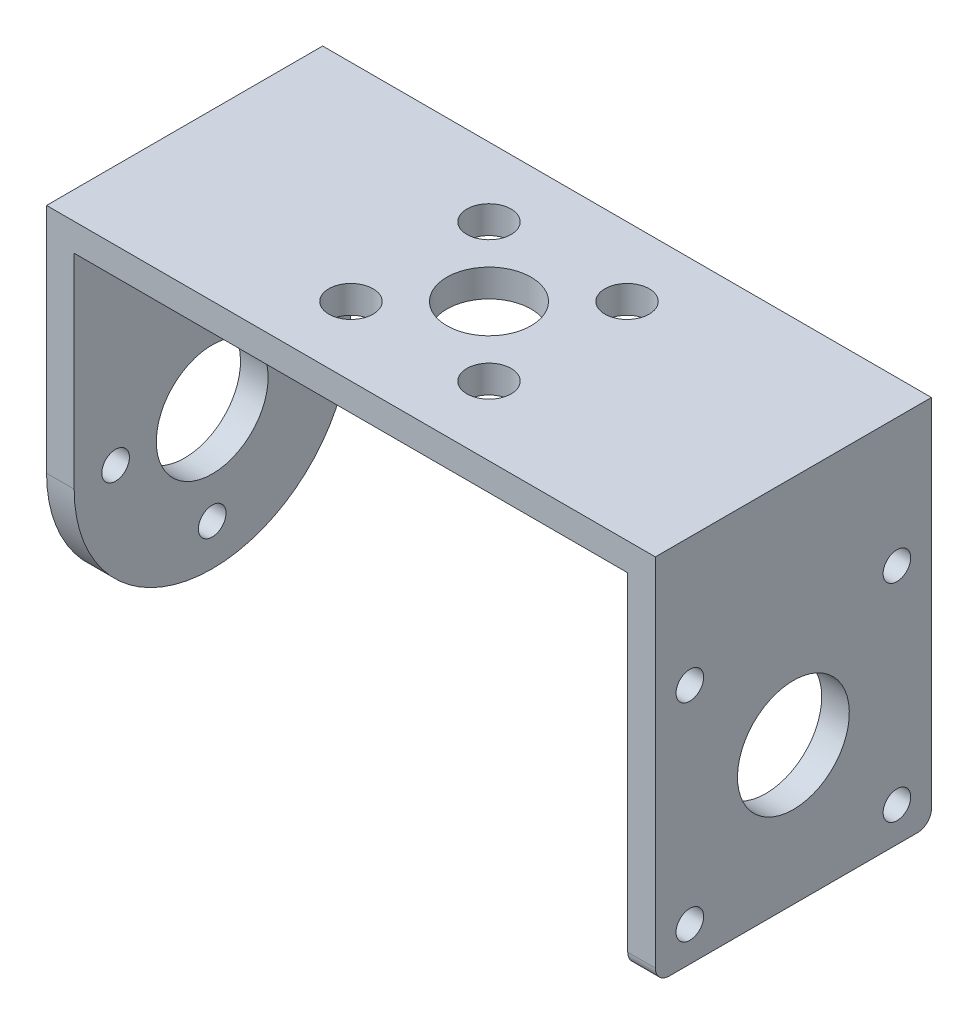
ISO-10303-21;
HEADER;
FILE_DESCRIPTION(('STEP AP214'),'2;1');
FILE_NAME('part.step','',(''),(''),'','','');
FILE_SCHEMA(('AUTOMOTIVE_DESIGN { 1 0 10303 214 1 1 1 1 }'));
ENDSEC;
DATA;
#1=APPLICATION_CONTEXT('core data for automotive mechanical design processes');
#2=APPLICATION_PROTOCOL_DEFINITION('international standard','automotive_design',2000,#1);
#3=PRODUCT_CONTEXT('',#1,'mechanical');
#4=PRODUCT('Part','Part','',(#3));
#5=PRODUCT_RELATED_PRODUCT_CATEGORY('part','',(#4));
#6=PRODUCT_DEFINITION_FORMATION('','',#4);
#7=PRODUCT_DEFINITION_CONTEXT('part definition',#1,'design');
#8=PRODUCT_DEFINITION('design','',#6,#7);
#9=PRODUCT_DEFINITION_SHAPE('','',#8);
#10=(LENGTH_UNIT() NAMED_UNIT(*) SI_UNIT(.MILLI.,.METRE.));
#11=(NAMED_UNIT(*) PLANE_ANGLE_UNIT() SI_UNIT($,.RADIAN.));
#12=(NAMED_UNIT(*) SI_UNIT($,.STERADIAN.) SOLID_ANGLE_UNIT());
#13=UNCERTAINTY_MEASURE_WITH_UNIT(LENGTH_MEASURE(1.E-05),#10,'distance_accuracy_value','');
#14=(GEOMETRIC_REPRESENTATION_CONTEXT(3) GLOBAL_UNCERTAINTY_ASSIGNED_CONTEXT((#13)) GLOBAL_UNIT_ASSIGNED_CONTEXT((#10,
#11,#12)) REPRESENTATION_CONTEXT('',''));
#15=CARTESIAN_POINT('',(0.,0.,0.));
#16=DIRECTION('',(0.,0.,1.));
#17=DIRECTION('',(1.,0.,0.));
#18=AXIS2_PLACEMENT_3D('',#15,#16,#17);
#19=CARTESIAN_POINT('',(-22.05,26.8,10.));
#20=DIRECTION('',(1.,0.,0.));
#21=DIRECTION('',(0.,1.,0.));
#22=AXIS2_PLACEMENT_3D('',#19,#20,#21);
#23=PLANE('',#22);
#24=CARTESIAN_POINT('',(-22.05,17.,0.));
#25=DIRECTION('',(-1.,0.,0.));
#26=DIRECTION('',(0.,-1.,0.));
#27=AXIS2_PLACEMENT_3D('',#24,#25,#26);
#28=CIRCLE('',#27,1.);
#29=CARTESIAN_POINT('',(-22.05,16.,0.));
#30=VERTEX_POINT('',#29);
#31=EDGE_CURVE('E409',#30,#30,#28,.T.);
#32=ORIENTED_EDGE('',*,*,#31,.F.);
#33=EDGE_LOOP('',(#32));
#34=FACE_BOUND('',#33,.T.);
#35=CARTESIAN_POINT('',(-22.05,9.99999999999999,-7.));
#36=DIRECTION('',(-1.,0.,0.));
#37=DIRECTION('',(0.,-1.,0.));
#38=AXIS2_PLACEMENT_3D('',#35,#36,#37);
#39=CIRCLE('',#38,1.);
#40=CARTESIAN_POINT('',(-22.05,8.99999999999999,-7.));
#41=VERTEX_POINT('',#40);
#42=EDGE_CURVE('E403',#41,#41,#39,.T.);
#43=ORIENTED_EDGE('',*,*,#42,.F.);
#44=EDGE_LOOP('',(#43));
#45=FACE_BOUND('',#44,.T.);
#46=CARTESIAN_POINT('',(-22.05,9.99999999999999,7.));
#47=DIRECTION('',(-1.,0.,0.));
#48=DIRECTION('',(0.,-1.,0.));
#49=AXIS2_PLACEMENT_3D('',#46,#47,#48);
#50=CIRCLE('',#49,1.);
#51=CARTESIAN_POINT('',(-22.05,8.99999999999999,7.));
#52=VERTEX_POINT('',#51);
#53=EDGE_CURVE('E397',#52,#52,#50,.T.);
#54=ORIENTED_EDGE('',*,*,#53,.F.);
#55=EDGE_LOOP('',(#54));
#56=FACE_BOUND('',#55,.T.);
#57=CARTESIAN_POINT('',(-22.05,3.,0.));
#58=DIRECTION('',(-1.,0.,0.));
#59=DIRECTION('',(0.,-1.,0.));
#60=AXIS2_PLACEMENT_3D('',#57,#58,#59);
#61=CIRCLE('',#60,1.);
#62=CARTESIAN_POINT('',(-22.05,2.,0.));
#63=VERTEX_POINT('',#62);
#64=EDGE_CURVE('E391',#63,#63,#61,.T.);
#65=ORIENTED_EDGE('',*,*,#64,.F.);
#66=EDGE_LOOP('',(#65));
#67=FACE_BOUND('',#66,.T.);
#68=CARTESIAN_POINT('',(-22.05,10.,0.));
#69=DIRECTION('',(-1.,0.,0.));
#70=DIRECTION('',(0.,-1.,0.));
#71=AXIS2_PLACEMENT_3D('',#68,#69,#70);
#72=CIRCLE('',#71,4.05);
#73=CARTESIAN_POINT('',(-22.05,5.95,0.));
#74=VERTEX_POINT('',#73);
#75=EDGE_CURVE('E385',#74,#74,#72,.T.);
#76=ORIENTED_EDGE('',*,*,#75,.F.);
#77=EDGE_LOOP('',(#76));
#78=FACE_BOUND('',#77,.T.);
#79=CARTESIAN_POINT('',(-22.05,10.,0.));
#80=DIRECTION('',(-1.,0.,0.));
#81=DIRECTION('',(0.,-1.,0.));
#82=AXIS2_PLACEMENT_3D('',#79,#80,#81);
#83=CIRCLE('',#82,10.);
#84=CARTESIAN_POINT('',(-22.05,9.99999999999999,-10.));
#85=VERTEX_POINT('',#84);
#86=CARTESIAN_POINT('',(-22.05,9.99999999999999,10.));
#87=VERTEX_POINT('',#86);
#88=EDGE_CURVE('E180',#85,#87,#83,.T.);
#89=ORIENTED_EDGE('',*,*,#88,.T.);
#90=DIRECTION('',(0.,-1.,0.));
#91=VECTOR('',#90,1.);
#92=CARTESIAN_POINT('',(-22.05,26.8,10.));
#93=LINE('',#92,#91);
#94=CARTESIAN_POINT('',(-22.05,26.8,10.));
#95=VERTEX_POINT('',#94);
#96=EDGE_CURVE('E129',#95,#87,#93,.T.);
#97=ORIENTED_EDGE('',*,*,#96,.F.);
#98=DIRECTION('',(0.,0.,-1.));
#99=VECTOR('',#98,1.);
#100=CARTESIAN_POINT('',(-22.05,26.8,10.));
#101=LINE('',#100,#99);
#102=CARTESIAN_POINT('',(-22.05,26.8,-10.));
#103=VERTEX_POINT('',#102);
#104=EDGE_CURVE('E151',#95,#103,#101,.T.);
#105=ORIENTED_EDGE('',*,*,#104,.T.);
#106=DIRECTION('',(0.,-1.,0.));
#107=VECTOR('',#106,1.);
#108=CARTESIAN_POINT('',(-22.05,26.8,-10.));
#109=LINE('',#108,#107);
#110=EDGE_CURVE('E152',#103,#85,#109,.T.);
#111=ORIENTED_EDGE('',*,*,#110,.T.);
#112=EDGE_LOOP('',(#89,#97,#105,#111));
#113=FACE_BOUND('',#112,.T.);
#114=ADVANCED_FACE('F32',(#34,#45,#56,#67,#78,#113),#23,.F.);
#115=CARTESIAN_POINT('',(-20.05,0.,10.));
#116=DIRECTION('',(-1.,0.,0.));
#117=DIRECTION('',(0.,-1.,0.));
#118=AXIS2_PLACEMENT_3D('',#115,#116,#117);
#119=PLANE('',#118);
#120=CARTESIAN_POINT('',(-20.05,17.,0.));
#121=DIRECTION('',(-1.,0.,0.));
#122=DIRECTION('',(0.,-1.,0.));
#123=AXIS2_PLACEMENT_3D('',#120,#121,#122);
#124=CIRCLE('',#123,1.);
#125=CARTESIAN_POINT('',(-20.05,16.,0.));
#126=VERTEX_POINT('',#125);
#127=EDGE_CURVE('E389',#126,#126,#124,.F.);
#128=ORIENTED_EDGE('',*,*,#127,.F.);
#129=EDGE_LOOP('',(#128));
#130=FACE_BOUND('',#129,.T.);
#131=CARTESIAN_POINT('',(-20.05,9.99999999999999,-7.));
#132=DIRECTION('',(-1.,0.,0.));
#133=DIRECTION('',(0.,-1.,0.));
#134=AXIS2_PLACEMENT_3D('',#131,#132,#133);
#135=CIRCLE('',#134,1.);
#136=CARTESIAN_POINT('',(-20.05,8.99999999999999,-7.));
#137=VERTEX_POINT('',#136);
#138=EDGE_CURVE('E406',#137,#137,#135,.F.);
#139=ORIENTED_EDGE('',*,*,#138,.F.);
#140=EDGE_LOOP('',(#139));
#141=FACE_BOUND('',#140,.T.);
#142=CARTESIAN_POINT('',(-20.05,9.99999999999999,7.));
#143=DIRECTION('',(-1.,0.,0.));
#144=DIRECTION('',(0.,-1.,0.));
#145=AXIS2_PLACEMENT_3D('',#142,#143,#144);
#146=CIRCLE('',#145,1.);
#147=CARTESIAN_POINT('',(-20.05,8.99999999999999,7.));
#148=VERTEX_POINT('',#147);
#149=EDGE_CURVE('E400',#148,#148,#146,.F.);
#150=ORIENTED_EDGE('',*,*,#149,.F.);
#151=EDGE_LOOP('',(#150));
#152=FACE_BOUND('',#151,.T.);
#153=CARTESIAN_POINT('',(-20.05,3.,0.));
#154=DIRECTION('',(-1.,0.,0.));
#155=DIRECTION('',(0.,-1.,0.));
#156=AXIS2_PLACEMENT_3D('',#153,#154,#155);
#157=CIRCLE('',#156,1.);
#158=CARTESIAN_POINT('',(-20.05,2.,0.));
#159=VERTEX_POINT('',#158);
#160=EDGE_CURVE('E394',#159,#159,#157,.F.);
#161=ORIENTED_EDGE('',*,*,#160,.F.);
#162=EDGE_LOOP('',(#161));
#163=FACE_BOUND('',#162,.T.);
#164=CARTESIAN_POINT('',(-20.05,10.,0.));
#165=DIRECTION('',(-1.,0.,0.));
#166=DIRECTION('',(0.,-1.,0.));
#167=AXIS2_PLACEMENT_3D('',#164,#165,#166);
#168=CIRCLE('',#167,4.05);
#169=CARTESIAN_POINT('',(-20.05,5.95,0.));
#170=VERTEX_POINT('',#169);
#171=EDGE_CURVE('E130',#170,#170,#168,.T.);
#172=ORIENTED_EDGE('',*,*,#171,.T.);
#173=EDGE_LOOP('',(#172));
#174=FACE_BOUND('',#173,.T.);
#175=DIRECTION('',(0.,1.,0.));
#176=VECTOR('',#175,1.);
#177=CARTESIAN_POINT('',(-20.05,0.,10.));
#178=LINE('',#177,#176);
#179=CARTESIAN_POINT('',(-20.05,10.,10.));
#180=VERTEX_POINT('',#179);
#181=CARTESIAN_POINT('',(-20.05,24.8,10.));
#182=VERTEX_POINT('',#181);
#183=EDGE_CURVE('E126',#180,#182,#178,.T.);
#184=ORIENTED_EDGE('',*,*,#183,.F.);
#185=CARTESIAN_POINT('',(-20.05,10.,0.));
#186=DIRECTION('',(-1.,0.,0.));
#187=DIRECTION('',(0.,-1.,0.));
#188=AXIS2_PLACEMENT_3D('',#185,#186,#187);
#189=CIRCLE('',#188,10.);
#190=CARTESIAN_POINT('',(-20.05,10.,-10.));
#191=VERTEX_POINT('',#190);
#192=EDGE_CURVE('E113',#180,#191,#189,.F.);
#193=ORIENTED_EDGE('',*,*,#192,.T.);
#194=DIRECTION('',(0.,1.,0.));
#195=VECTOR('',#194,1.);
#196=CARTESIAN_POINT('',(-20.05,0.,-10.));
#197=LINE('',#196,#195);
#198=CARTESIAN_POINT('',(-20.05,24.8,-10.));
#199=VERTEX_POINT('',#198);
#200=EDGE_CURVE('E155',#191,#199,#197,.T.);
#201=ORIENTED_EDGE('',*,*,#200,.T.);
#202=DIRECTION('',(0.,0.,-1.));
#203=VECTOR('',#202,1.);
#204=CARTESIAN_POINT('',(-20.05,24.8,10.));
#205=LINE('',#204,#203);
#206=EDGE_CURVE('E134',#182,#199,#205,.T.);
#207=ORIENTED_EDGE('',*,*,#206,.F.);
#208=EDGE_LOOP('',(#184,#193,#201,#207));
#209=FACE_BOUND('',#208,.T.);
#210=ADVANCED_FACE('F132',(#130,#141,#152,#163,#174,#209),#119,.F.);
#211=CARTESIAN_POINT('',(20.05,24.8,10.));
#212=DIRECTION('',(0.,1.,0.));
#213=DIRECTION('',(0.,0.,1.));
#214=AXIS2_PLACEMENT_3D('',#211,#212,#213);
#215=PLANE('',#214);
#216=CARTESIAN_POINT('',(-5.,24.8,5.));
#217=DIRECTION('',(0.,1.,0.));
#218=DIRECTION('',(0.,0.,1.));
#219=AXIS2_PLACEMENT_3D('',#216,#217,#218);
#220=CIRCLE('',#219,1.6);
#221=CARTESIAN_POINT('',(-5.,24.8,6.6));
#222=VERTEX_POINT('',#221);
#223=EDGE_CURVE('E143',#222,#222,#220,.T.);
#224=ORIENTED_EDGE('',*,*,#223,.T.);
#225=EDGE_LOOP('',(#224));
#226=FACE_BOUND('',#225,.T.);
#227=CARTESIAN_POINT('',(5.,24.8,5.));
#228=DIRECTION('',(0.,1.,0.));
#229=DIRECTION('',(0.,0.,1.));
#230=AXIS2_PLACEMENT_3D('',#227,#228,#229);
#231=CIRCLE('',#230,1.6);
#232=CARTESIAN_POINT('',(5.,24.8,6.6));
#233=VERTEX_POINT('',#232);
#234=EDGE_CURVE('E238',#233,#233,#231,.T.);
#235=ORIENTED_EDGE('',*,*,#234,.T.);
#236=EDGE_LOOP('',(#235));
#237=FACE_BOUND('',#236,.T.);
#238=CARTESIAN_POINT('',(-5.,24.8,-5.));
#239=DIRECTION('',(0.,1.,0.));
#240=DIRECTION('',(0.,0.,1.));
#241=AXIS2_PLACEMENT_3D('',#238,#239,#240);
#242=CIRCLE('',#241,1.6);
#243=CARTESIAN_POINT('',(-5.,24.8,-3.4));
#244=VERTEX_POINT('',#243);
#245=EDGE_CURVE('E236',#244,#244,#242,.T.);
#246=ORIENTED_EDGE('',*,*,#245,.T.);
#247=EDGE_LOOP('',(#246));
#248=FACE_BOUND('',#247,.T.);
#249=CARTESIAN_POINT('',(5.,24.8,-5.));
#250=DIRECTION('',(0.,1.,0.));
#251=DIRECTION('',(0.,0.,1.));
#252=AXIS2_PLACEMENT_3D('',#249,#250,#251);
#253=CIRCLE('',#252,1.6);
#254=CARTESIAN_POINT('',(5.,24.8,-3.4));
#255=VERTEX_POINT('',#254);
#256=EDGE_CURVE('E233',#255,#255,#253,.T.);
#257=ORIENTED_EDGE('',*,*,#256,.T.);
#258=EDGE_LOOP('',(#257));
#259=FACE_BOUND('',#258,.T.);
#260=CARTESIAN_POINT('',(0.,24.8,0.));
#261=DIRECTION('',(0.,1.,0.));
#262=DIRECTION('',(0.,0.,1.));
#263=AXIS2_PLACEMENT_3D('',#260,#261,#262);
#264=CIRCLE('',#263,3.05);
#265=CARTESIAN_POINT('',(0.,24.8,3.05));
#266=VERTEX_POINT('',#265);
#267=EDGE_CURVE('E230',#266,#266,#264,.T.);
#268=ORIENTED_EDGE('',*,*,#267,.T.);
#269=EDGE_LOOP('',(#268));
#270=FACE_BOUND('',#269,.T.);
#271=DIRECTION('',(1.,0.,0.));
#272=VECTOR('',#271,1.);
#273=CARTESIAN_POINT('',(20.05,24.8,-10.));
#274=LINE('',#273,#272);
#275=CARTESIAN_POINT('',(20.05,24.8,-10.));
#276=VERTEX_POINT('',#275);
#277=EDGE_CURVE('E157',#199,#276,#274,.T.);
#278=ORIENTED_EDGE('',*,*,#277,.T.);
#279=DIRECTION('',(0.,0.,-1.));
#280=VECTOR('',#279,1.);
#281=CARTESIAN_POINT('',(20.05,24.8,10.));
#282=LINE('',#281,#280);
#283=CARTESIAN_POINT('',(20.05,24.8,10.));
#284=VERTEX_POINT('',#283);
#285=EDGE_CURVE('E175',#284,#276,#282,.T.);
#286=ORIENTED_EDGE('',*,*,#285,.F.);
#287=DIRECTION('',(1.,0.,0.));
#288=VECTOR('',#287,1.);
#289=CARTESIAN_POINT('',(20.05,24.8,10.));
#290=LINE('',#289,#288);
#291=EDGE_CURVE('E136',#182,#284,#290,.T.);
#292=ORIENTED_EDGE('',*,*,#291,.F.);
#293=ORIENTED_EDGE('',*,*,#206,.T.);
#294=EDGE_LOOP('',(#278,#286,#292,#293));
#295=FACE_BOUND('',#294,.T.);
#296=ADVANCED_FACE('F245',(#226,#237,#248,#259,#270,#295),#215,.F.);
#297=CARTESIAN_POINT('',(20.05,0.,10.));
#298=DIRECTION('',(1.,0.,0.));
#299=DIRECTION('',(0.,1.,0.));
#300=AXIS2_PLACEMENT_3D('',#297,#298,#299);
#301=PLANE('',#300);
#302=CARTESIAN_POINT('',(20.05,17.5,7.5));
#303=DIRECTION('',(1.,0.,0.));
#304=DIRECTION('',(0.,1.,0.));
#305=AXIS2_PLACEMENT_3D('',#302,#303,#304);
#306=CIRCLE('',#305,0.999999999999999);
#307=CARTESIAN_POINT('',(20.05,18.5,7.5));
#308=VERTEX_POINT('',#307);
#309=EDGE_CURVE('E364',#308,#308,#306,.F.);
#310=ORIENTED_EDGE('',*,*,#309,.F.);
#311=EDGE_LOOP('',(#310));
#312=FACE_BOUND('',#311,.T.);
#313=CARTESIAN_POINT('',(20.05,17.5,-7.5));
#314=DIRECTION('',(1.,0.,0.));
#315=DIRECTION('',(0.,1.,0.));
#316=AXIS2_PLACEMENT_3D('',#313,#314,#315);
#317=CIRCLE('',#316,1.);
#318=CARTESIAN_POINT('',(20.05,18.5,-7.5));
#319=VERTEX_POINT('',#318);
#320=EDGE_CURVE('E368',#319,#319,#317,.F.);
#321=ORIENTED_EDGE('',*,*,#320,.F.);
#322=EDGE_LOOP('',(#321));
#323=FACE_BOUND('',#322,.T.);
#324=CARTESIAN_POINT('',(20.05,2.5,-7.5));
#325=DIRECTION('',(1.,0.,0.));
#326=DIRECTION('',(0.,1.,0.));
#327=AXIS2_PLACEMENT_3D('',#324,#325,#326);
#328=CIRCLE('',#327,1.);
#329=CARTESIAN_POINT('',(20.05,3.5,-7.5));
#330=VERTEX_POINT('',#329);
#331=EDGE_CURVE('E372',#330,#330,#328,.F.);
#332=ORIENTED_EDGE('',*,*,#331,.F.);
#333=EDGE_LOOP('',(#332));
#334=FACE_BOUND('',#333,.T.);
#335=CARTESIAN_POINT('',(20.05,2.5,7.5));
#336=DIRECTION('',(1.,0.,0.));
#337=DIRECTION('',(0.,1.,0.));
#338=AXIS2_PLACEMENT_3D('',#335,#336,#337);
#339=CIRCLE('',#338,0.999999999999999);
#340=CARTESIAN_POINT('',(20.05,3.5,7.5));
#341=VERTEX_POINT('',#340);
#342=EDGE_CURVE('E376',#341,#341,#339,.F.);
#343=ORIENTED_EDGE('',*,*,#342,.F.);
#344=EDGE_LOOP('',(#343));
#345=FACE_BOUND('',#344,.T.);
#346=CARTESIAN_POINT('',(20.05,10.,0.));
#347=DIRECTION('',(1.,0.,0.));
#348=DIRECTION('',(0.,1.,0.));
#349=AXIS2_PLACEMENT_3D('',#346,#347,#348);
#350=CIRCLE('',#349,4.05);
#351=CARTESIAN_POINT('',(20.05,14.05,0.));
#352=VERTEX_POINT('',#351);
#353=EDGE_CURVE('E379',#352,#352,#350,.T.);
#354=ORIENTED_EDGE('',*,*,#353,.T.);
#355=EDGE_LOOP('',(#354));
#356=FACE_BOUND('',#355,.T.);
#357=DIRECTION('',(0.,-1.,0.));
#358=VECTOR('',#357,1.);
#359=CARTESIAN_POINT('',(20.05,0.,-10.));
#360=LINE('',#359,#358);
#361=CARTESIAN_POINT('',(20.05,1.,-10.));
#362=VERTEX_POINT('',#361);
#363=EDGE_CURVE('E159',#276,#362,#360,.T.);
#364=ORIENTED_EDGE('',*,*,#363,.T.);
#365=CARTESIAN_POINT('',(20.05,1.,-9.));
#366=DIRECTION('',(1.,0.,0.));
#367=DIRECTION('',(0.,1.,0.));
#368=AXIS2_PLACEMENT_3D('',#365,#366,#367);
#369=CIRCLE('',#368,1.);
#370=CARTESIAN_POINT('',(20.05,0.,-9.));
#371=VERTEX_POINT('',#370);
#372=EDGE_CURVE('E40',#362,#371,#369,.F.);
#373=ORIENTED_EDGE('',*,*,#372,.T.);
#374=DIRECTION('',(0.,0.,-1.));
#375=VECTOR('',#374,1.);
#376=CARTESIAN_POINT('',(20.05,0.,10.));
#377=LINE('',#376,#375);
#378=CARTESIAN_POINT('',(20.05,0.,9.));
#379=VERTEX_POINT('',#378);
#380=EDGE_CURVE('E172',#379,#371,#377,.T.);
#381=ORIENTED_EDGE('',*,*,#380,.F.);
#382=CARTESIAN_POINT('',(20.05,1.,9.));
#383=DIRECTION('',(1.,0.,0.));
#384=DIRECTION('',(0.,1.,0.));
#385=AXIS2_PLACEMENT_3D('',#382,#383,#384);
#386=CIRCLE('',#385,1.);
#387=CARTESIAN_POINT('',(20.05,1.,10.));
#388=VERTEX_POINT('',#387);
#389=EDGE_CURVE('E47',#379,#388,#386,.F.);
#390=ORIENTED_EDGE('',*,*,#389,.T.);
#391=DIRECTION('',(0.,-1.,0.));
#392=VECTOR('',#391,1.);
#393=CARTESIAN_POINT('',(20.05,0.,10.));
#394=LINE('',#393,#392);
#395=EDGE_CURVE('E138',#284,#388,#394,.T.);
#396=ORIENTED_EDGE('',*,*,#395,.F.);
#397=ORIENTED_EDGE('',*,*,#285,.T.);
#398=EDGE_LOOP('',(#364,#373,#381,#390,#396,#397));
#399=FACE_BOUND('',#398,.T.);
#400=ADVANCED_FACE('F193',(#312,#323,#334,#345,#356,#399),#301,.F.);
#401=CARTESIAN_POINT('',(22.05,0.,10.));
#402=DIRECTION('',(0.,1.,0.));
#403=DIRECTION('',(-1.,0.,0.));
#404=AXIS2_PLACEMENT_3D('',#401,#402,#403);
#405=PLANE('',#404);
#406=ORIENTED_EDGE('',*,*,#380,.T.);
#407=DIRECTION('',(1.,0.,0.));
#408=VECTOR('',#407,1.);
#409=CARTESIAN_POINT('',(22.05,0.,-9.));
#410=LINE('',#409,#408);
#411=CARTESIAN_POINT('',(22.05,0.,-9.));
#412=VERTEX_POINT('',#411);
#413=EDGE_CURVE('E184',#371,#412,#410,.T.);
#414=ORIENTED_EDGE('',*,*,#413,.T.);
#415=DIRECTION('',(0.,0.,-1.));
#416=VECTOR('',#415,1.);
#417=CARTESIAN_POINT('',(22.05,0.,10.));
#418=LINE('',#417,#416);
#419=CARTESIAN_POINT('',(22.05,0.,9.));
#420=VERTEX_POINT('',#419);
#421=EDGE_CURVE('E169',#420,#412,#418,.T.);
#422=ORIENTED_EDGE('',*,*,#421,.F.);
#423=DIRECTION('',(1.,0.,0.));
#424=VECTOR('',#423,1.);
#425=CARTESIAN_POINT('',(20.05,0.,9.));
#426=LINE('',#425,#424);
#427=EDGE_CURVE('E179',#420,#379,#426,.F.);
#428=ORIENTED_EDGE('',*,*,#427,.T.);
#429=EDGE_LOOP('',(#406,#414,#422,#428));
#430=FACE_BOUND('',#429,.T.);
#431=ADVANCED_FACE('F197',(#430),#405,.F.);
#432=CARTESIAN_POINT('',(22.05,26.8,10.));
#433=DIRECTION('',(-1.,0.,0.));
#434=DIRECTION('',(0.,-1.,0.));
#435=AXIS2_PLACEMENT_3D('',#432,#433,#434);
#436=PLANE('',#435);
#437=CARTESIAN_POINT('',(22.05,17.5,7.5));
#438=DIRECTION('',(1.,0.,0.));
#439=DIRECTION('',(0.,1.,0.));
#440=AXIS2_PLACEMENT_3D('',#437,#438,#439);
#441=CIRCLE('',#440,0.999999999999999);
#442=CARTESIAN_POINT('',(22.05,18.5,7.5));
#443=VERTEX_POINT('',#442);
#444=EDGE_CURVE('E418',#443,#443,#441,.T.);
#445=ORIENTED_EDGE('',*,*,#444,.F.);
#446=EDGE_LOOP('',(#445));
#447=FACE_BOUND('',#446,.T.);
#448=CARTESIAN_POINT('',(22.05,17.5,-7.5));
#449=DIRECTION('',(1.,0.,0.));
#450=DIRECTION('',(0.,1.,0.));
#451=AXIS2_PLACEMENT_3D('',#448,#449,#450);
#452=CIRCLE('',#451,1.);
#453=CARTESIAN_POINT('',(22.05,18.5,-7.5));
#454=VERTEX_POINT('',#453);
#455=EDGE_CURVE('E421',#454,#454,#452,.T.);
#456=ORIENTED_EDGE('',*,*,#455,.F.);
#457=EDGE_LOOP('',(#456));
#458=FACE_BOUND('',#457,.T.);
#459=CARTESIAN_POINT('',(22.05,2.5,-7.5));
#460=DIRECTION('',(1.,0.,0.));
#461=DIRECTION('',(0.,1.,0.));
#462=AXIS2_PLACEMENT_3D('',#459,#460,#461);
#463=CIRCLE('',#462,1.);
#464=CARTESIAN_POINT('',(22.05,3.5,-7.5));
#465=VERTEX_POINT('',#464);
#466=EDGE_CURVE('E424',#465,#465,#463,.T.);
#467=ORIENTED_EDGE('',*,*,#466,.F.);
#468=EDGE_LOOP('',(#467));
#469=FACE_BOUND('',#468,.T.);
#470=CARTESIAN_POINT('',(22.05,2.5,7.5));
#471=DIRECTION('',(1.,0.,0.));
#472=DIRECTION('',(0.,1.,0.));
#473=AXIS2_PLACEMENT_3D('',#470,#471,#472);
#474=CIRCLE('',#473,0.999999999999999);
#475=CARTESIAN_POINT('',(22.05,3.5,7.5));
#476=VERTEX_POINT('',#475);
#477=EDGE_CURVE('E414',#476,#476,#474,.T.);
#478=ORIENTED_EDGE('',*,*,#477,.F.);
#479=EDGE_LOOP('',(#478));
#480=FACE_BOUND('',#479,.T.);
#481=CARTESIAN_POINT('',(22.05,10.,0.));
#482=DIRECTION('',(-1.,0.,0.));
#483=DIRECTION('',(0.,-1.,0.));
#484=AXIS2_PLACEMENT_3D('',#481,#482,#483);
#485=CIRCLE('',#484,4.05);
#486=CARTESIAN_POINT('',(22.05,5.95,0.));
#487=VERTEX_POINT('',#486);
#488=EDGE_CURVE('E381',#487,#487,#485,.T.);
#489=ORIENTED_EDGE('',*,*,#488,.T.);
#490=EDGE_LOOP('',(#489));
#491=FACE_BOUND('',#490,.T.);
#492=ORIENTED_EDGE('',*,*,#421,.T.);
#493=CARTESIAN_POINT('',(22.05,1.,-9.));
#494=DIRECTION('',(-1.,0.,0.));
#495=DIRECTION('',(0.,-1.,0.));
#496=AXIS2_PLACEMENT_3D('',#493,#494,#495);
#497=CIRCLE('',#496,1.);
#498=CARTESIAN_POINT('',(22.05,1.,-10.));
#499=VERTEX_POINT('',#498);
#500=EDGE_CURVE('E189',#412,#499,#497,.F.);
#501=ORIENTED_EDGE('',*,*,#500,.T.);
#502=DIRECTION('',(0.,1.,0.));
#503=VECTOR('',#502,1.);
#504=CARTESIAN_POINT('',(22.05,26.8,-10.));
#505=LINE('',#504,#503);
#506=CARTESIAN_POINT('',(22.05,26.8,-10.));
#507=VERTEX_POINT('',#506);
#508=EDGE_CURVE('E161',#499,#507,#505,.T.);
#509=ORIENTED_EDGE('',*,*,#508,.T.);
#510=DIRECTION('',(0.,0.,-1.));
#511=VECTOR('',#510,1.);
#512=CARTESIAN_POINT('',(22.05,26.8,10.));
#513=LINE('',#512,#511);
#514=CARTESIAN_POINT('',(22.05,26.8,10.));
#515=VERTEX_POINT('',#514);
#516=EDGE_CURVE('E166',#515,#507,#513,.T.);
#517=ORIENTED_EDGE('',*,*,#516,.F.);
#518=DIRECTION('',(0.,1.,0.));
#519=VECTOR('',#518,1.);
#520=CARTESIAN_POINT('',(22.05,26.8,10.));
#521=LINE('',#520,#519);
#522=CARTESIAN_POINT('',(22.05,1.,10.));
#523=VERTEX_POINT('',#522);
#524=EDGE_CURVE('E147',#523,#515,#521,.T.);
#525=ORIENTED_EDGE('',*,*,#524,.F.);
#526=CARTESIAN_POINT('',(22.05,1.,9.));
#527=DIRECTION('',(-1.,0.,0.));
#528=DIRECTION('',(0.,-1.,0.));
#529=AXIS2_PLACEMENT_3D('',#526,#527,#528);
#530=CIRCLE('',#529,1.);
#531=EDGE_CURVE('E187',#523,#420,#530,.F.);
#532=ORIENTED_EDGE('',*,*,#531,.T.);
#533=EDGE_LOOP('',(#492,#501,#509,#517,#525,#532));
#534=FACE_BOUND('',#533,.T.);
#535=ADVANCED_FACE('F202',(#447,#458,#469,#480,#491,#534),#436,.F.);
#536=CARTESIAN_POINT('',(-22.05,26.8,10.));
#537=DIRECTION('',(0.,-1.,0.));
#538=DIRECTION('',(0.,0.,-1.));
#539=AXIS2_PLACEMENT_3D('',#536,#537,#538);
#540=PLANE('',#539);
#541=CARTESIAN_POINT('',(-5.,26.8,5.));
#542=DIRECTION('',(0.,1.,0.));
#543=DIRECTION('',(0.,0.,1.));
#544=AXIS2_PLACEMENT_3D('',#541,#542,#543);
#545=CIRCLE('',#544,1.6);
#546=CARTESIAN_POINT('',(-5.,26.8,6.6));
#547=VERTEX_POINT('',#546);
#548=EDGE_CURVE('E181',#547,#547,#545,.T.);
#549=ORIENTED_EDGE('',*,*,#548,.F.);
#550=EDGE_LOOP('',(#549));
#551=FACE_BOUND('',#550,.T.);
#552=CARTESIAN_POINT('',(5.,26.8,5.));
#553=DIRECTION('',(0.,1.,0.));
#554=DIRECTION('',(0.,0.,1.));
#555=AXIS2_PLACEMENT_3D('',#552,#553,#554);
#556=CIRCLE('',#555,1.6);
#557=CARTESIAN_POINT('',(5.,26.8,6.6));
#558=VERTEX_POINT('',#557);
#559=EDGE_CURVE('E223',#558,#558,#556,.T.);
#560=ORIENTED_EDGE('',*,*,#559,.F.);
#561=EDGE_LOOP('',(#560));
#562=FACE_BOUND('',#561,.T.);
#563=CARTESIAN_POINT('',(-5.,26.8,-5.));
#564=DIRECTION('',(0.,1.,0.));
#565=DIRECTION('',(0.,0.,1.));
#566=AXIS2_PLACEMENT_3D('',#563,#564,#565);
#567=CIRCLE('',#566,1.6);
#568=CARTESIAN_POINT('',(-5.,26.8,-3.4));
#569=VERTEX_POINT('',#568);
#570=EDGE_CURVE('E220',#569,#569,#567,.T.);
#571=ORIENTED_EDGE('',*,*,#570,.F.);
#572=EDGE_LOOP('',(#571));
#573=FACE_BOUND('',#572,.T.);
#574=CARTESIAN_POINT('',(5.,26.8,-5.));
#575=DIRECTION('',(0.,1.,0.));
#576=DIRECTION('',(0.,0.,1.));
#577=AXIS2_PLACEMENT_3D('',#574,#575,#576);
#578=CIRCLE('',#577,1.6);
#579=CARTESIAN_POINT('',(5.,26.8,-3.4));
#580=VERTEX_POINT('',#579);
#581=EDGE_CURVE('E216',#580,#580,#578,.T.);
#582=ORIENTED_EDGE('',*,*,#581,.F.);
#583=EDGE_LOOP('',(#582));
#584=FACE_BOUND('',#583,.T.);
#585=CARTESIAN_POINT('',(0.,26.8,0.));
#586=DIRECTION('',(0.,1.,0.));
#587=DIRECTION('',(0.,0.,1.));
#588=AXIS2_PLACEMENT_3D('',#585,#586,#587);
#589=CIRCLE('',#588,3.05);
#590=CARTESIAN_POINT('',(0.,26.8,3.05));
#591=VERTEX_POINT('',#590);
#592=EDGE_CURVE('E219',#591,#591,#589,.T.);
#593=ORIENTED_EDGE('',*,*,#592,.F.);
#594=EDGE_LOOP('',(#593));
#595=FACE_BOUND('',#594,.T.);
#596=DIRECTION('',(-1.,0.,0.));
#597=VECTOR('',#596,1.);
#598=CARTESIAN_POINT('',(-22.05,26.8,-10.));
#599=LINE('',#598,#597);
#600=EDGE_CURVE('E140',#507,#103,#599,.T.);
#601=ORIENTED_EDGE('',*,*,#600,.T.);
#602=ORIENTED_EDGE('',*,*,#104,.F.);
#603=DIRECTION('',(-1.,0.,0.));
#604=VECTOR('',#603,1.);
#605=CARTESIAN_POINT('',(-22.05,26.8,10.));
#606=LINE('',#605,#604);
#607=EDGE_CURVE('E149',#515,#95,#606,.T.);
#608=ORIENTED_EDGE('',*,*,#607,.F.);
#609=ORIENTED_EDGE('',*,*,#516,.T.);
#610=EDGE_LOOP('',(#601,#602,#608,#609));
#611=FACE_BOUND('',#610,.T.);
#612=ADVANCED_FACE('F209',(#551,#562,#573,#584,#595,#611),#540,.F.);
#613=CARTESIAN_POINT('',(0.,0.,10.));
#614=DIRECTION('',(0.,0.,1.));
#615=DIRECTION('',(1.,0.,0.));
#616=AXIS2_PLACEMENT_3D('',#613,#614,#615);
#617=PLANE('',#616);
#618=ORIENTED_EDGE('',*,*,#395,.T.);
#619=DIRECTION('',(1.,0.,0.));
#620=VECTOR('',#619,1.);
#621=CARTESIAN_POINT('',(22.05,1.,10.));
#622=LINE('',#621,#620);
#623=EDGE_CURVE('E11',#388,#523,#622,.T.);
#624=ORIENTED_EDGE('',*,*,#623,.T.);
#625=ORIENTED_EDGE('',*,*,#524,.T.);
#626=ORIENTED_EDGE('',*,*,#607,.T.);
#627=ORIENTED_EDGE('',*,*,#96,.T.);
#628=DIRECTION('',(-1.,0.,0.));
#629=VECTOR('',#628,1.);
#630=CARTESIAN_POINT('',(22.051,10.,10.));
#631=LINE('',#630,#629);
#632=EDGE_CURVE('E116',#180,#87,#631,.T.);
#633=ORIENTED_EDGE('',*,*,#632,.F.);
#634=ORIENTED_EDGE('',*,*,#183,.T.);
#635=ORIENTED_EDGE('',*,*,#291,.T.);
#636=EDGE_LOOP('',(#618,#624,#625,#626,#627,#633,#634,#635));
#637=FACE_BOUND('',#636,.T.);
#638=ADVANCED_FACE('F125',(#637),#617,.T.);
#639=CARTESIAN_POINT('',(0.,0.,-10.));
#640=DIRECTION('',(0.,0.,1.));
#641=DIRECTION('',(1.,0.,0.));
#642=AXIS2_PLACEMENT_3D('',#639,#640,#641);
#643=PLANE('',#642);
#644=ORIENTED_EDGE('',*,*,#508,.F.);
#645=DIRECTION('',(1.,0.,0.));
#646=VECTOR('',#645,1.);
#647=CARTESIAN_POINT('',(0.,0.999999999999999,-10.));
#648=LINE('',#647,#646);
#649=EDGE_CURVE('E55',#499,#362,#648,.F.);
#650=ORIENTED_EDGE('',*,*,#649,.T.);
#651=ORIENTED_EDGE('',*,*,#363,.F.);
#652=ORIENTED_EDGE('',*,*,#277,.F.);
#653=ORIENTED_EDGE('',*,*,#200,.F.);
#654=DIRECTION('',(-1.,0.,0.));
#655=VECTOR('',#654,1.);
#656=CARTESIAN_POINT('',(22.051,10.,-10.));
#657=LINE('',#656,#655);
#658=EDGE_CURVE('E119',#191,#85,#657,.T.);
#659=ORIENTED_EDGE('',*,*,#658,.T.);
#660=ORIENTED_EDGE('',*,*,#110,.F.);
#661=ORIENTED_EDGE('',*,*,#600,.F.);
#662=EDGE_LOOP('',(#644,#650,#651,#652,#653,#659,#660,#661));
#663=FACE_BOUND('',#662,.T.);
#664=ADVANCED_FACE('F205',(#663),#643,.F.);
#665=CARTESIAN_POINT('',(0.,0.,0.));
#666=DIRECTION('',(0.,1.,0.));
#667=DIRECTION('',(0.,0.,1.));
#668=AXIS2_PLACEMENT_3D('',#665,#666,#667);
#669=CYLINDRICAL_SURFACE('',#668,3.05);
#670=ORIENTED_EDGE('',*,*,#592,.T.);
#671=EDGE_LOOP('',(#670));
#672=FACE_BOUND('',#671,.T.);
#673=ORIENTED_EDGE('',*,*,#267,.F.);
#674=EDGE_LOOP('',(#673));
#675=FACE_BOUND('',#674,.T.);
#676=ADVANCED_FACE('F320',(#672,#675),#669,.F.);
#677=CARTESIAN_POINT('',(5.,0.,-5.));
#678=DIRECTION('',(0.,1.,0.));
#679=DIRECTION('',(0.,0.,1.));
#680=AXIS2_PLACEMENT_3D('',#677,#678,#679);
#681=CYLINDRICAL_SURFACE('',#680,1.6);
#682=ORIENTED_EDGE('',*,*,#581,.T.);
#683=EDGE_LOOP('',(#682));
#684=FACE_BOUND('',#683,.T.);
#685=ORIENTED_EDGE('',*,*,#256,.F.);
#686=EDGE_LOOP('',(#685));
#687=FACE_BOUND('',#686,.T.);
#688=ADVANCED_FACE('F317',(#684,#687),#681,.F.);
#689=CARTESIAN_POINT('',(-5.,0.,-5.));
#690=DIRECTION('',(0.,1.,0.));
#691=DIRECTION('',(0.,0.,1.));
#692=AXIS2_PLACEMENT_3D('',#689,#690,#691);
#693=CYLINDRICAL_SURFACE('',#692,1.6);
#694=ORIENTED_EDGE('',*,*,#570,.T.);
#695=EDGE_LOOP('',(#694));
#696=FACE_BOUND('',#695,.T.);
#697=ORIENTED_EDGE('',*,*,#245,.F.);
#698=EDGE_LOOP('',(#697));
#699=FACE_BOUND('',#698,.T.);
#700=ADVANCED_FACE('F258',(#696,#699),#693,.F.);
#701=CARTESIAN_POINT('',(5.,0.,5.));
#702=DIRECTION('',(0.,1.,0.));
#703=DIRECTION('',(0.,0.,1.));
#704=AXIS2_PLACEMENT_3D('',#701,#702,#703);
#705=CYLINDRICAL_SURFACE('',#704,1.6);
#706=ORIENTED_EDGE('',*,*,#559,.T.);
#707=EDGE_LOOP('',(#706));
#708=FACE_BOUND('',#707,.T.);
#709=ORIENTED_EDGE('',*,*,#234,.F.);
#710=EDGE_LOOP('',(#709));
#711=FACE_BOUND('',#710,.T.);
#712=ADVANCED_FACE('F249',(#708,#711),#705,.F.);
#713=CARTESIAN_POINT('',(-5.,0.,5.));
#714=DIRECTION('',(0.,1.,0.));
#715=DIRECTION('',(0.,0.,1.));
#716=AXIS2_PLACEMENT_3D('',#713,#714,#715);
#717=CYLINDRICAL_SURFACE('',#716,1.6);
#718=ORIENTED_EDGE('',*,*,#548,.T.);
#719=EDGE_LOOP('',(#718));
#720=FACE_BOUND('',#719,.T.);
#721=ORIENTED_EDGE('',*,*,#223,.F.);
#722=EDGE_LOOP('',(#721));
#723=FACE_BOUND('',#722,.T.);
#724=ADVANCED_FACE('F247',(#720,#723),#717,.F.);
#725=CARTESIAN_POINT('',(22.051,10.,0.));
#726=DIRECTION('',(-1.,0.,0.));
#727=DIRECTION('',(0.,-1.,0.));
#728=AXIS2_PLACEMENT_3D('',#725,#726,#727);
#729=CYLINDRICAL_SURFACE('',#728,10.);
#730=ORIENTED_EDGE('',*,*,#88,.F.);
#731=ORIENTED_EDGE('',*,*,#658,.F.);
#732=ORIENTED_EDGE('',*,*,#192,.F.);
#733=ORIENTED_EDGE('',*,*,#632,.T.);
#734=EDGE_LOOP('',(#730,#731,#732,#733));
#735=FACE_BOUND('',#734,.T.);
#736=ADVANCED_FACE('F115',(#735),#729,.T.);
#737=CARTESIAN_POINT('',(22.05,10.,0.));
#738=DIRECTION('',(-1.,0.,0.));
#739=DIRECTION('',(0.,-1.,0.));
#740=AXIS2_PLACEMENT_3D('',#737,#738,#739);
#741=CYLINDRICAL_SURFACE('',#740,4.05);
#742=ORIENTED_EDGE('',*,*,#488,.F.);
#743=EDGE_LOOP('',(#742));
#744=FACE_BOUND('',#743,.T.);
#745=ORIENTED_EDGE('',*,*,#353,.F.);
#746=EDGE_LOOP('',(#745));
#747=FACE_BOUND('',#746,.T.);
#748=ADVANCED_FACE('F256',(#744,#747),#741,.F.);
#749=ORIENTED_EDGE('',*,*,#75,.T.);
#750=EDGE_LOOP('',(#749));
#751=FACE_BOUND('',#750,.T.);
#752=ORIENTED_EDGE('',*,*,#171,.F.);
#753=EDGE_LOOP('',(#752));
#754=FACE_BOUND('',#753,.T.);
#755=ADVANCED_FACE('F312',(#751,#754),#741,.F.);
#756=CARTESIAN_POINT('',(22.051,3.,0.));
#757=DIRECTION('',(-1.,0.,0.));
#758=DIRECTION('',(0.,-1.,0.));
#759=AXIS2_PLACEMENT_3D('',#756,#757,#758);
#760=CYLINDRICAL_SURFACE('',#759,1.);
#761=ORIENTED_EDGE('',*,*,#64,.T.);
#762=EDGE_LOOP('',(#761));
#763=FACE_BOUND('',#762,.T.);
#764=ORIENTED_EDGE('',*,*,#160,.T.);
#765=EDGE_LOOP('',(#764));
#766=FACE_BOUND('',#765,.T.);
#767=ADVANCED_FACE('F308',(#763,#766),#760,.F.);
#768=CARTESIAN_POINT('',(22.051,10.,7.));
#769=DIRECTION('',(-1.,0.,0.));
#770=DIRECTION('',(0.,-1.,0.));
#771=AXIS2_PLACEMENT_3D('',#768,#769,#770);
#772=CYLINDRICAL_SURFACE('',#771,1.);
#773=ORIENTED_EDGE('',*,*,#53,.T.);
#774=EDGE_LOOP('',(#773));
#775=FACE_BOUND('',#774,.T.);
#776=ORIENTED_EDGE('',*,*,#149,.T.);
#777=EDGE_LOOP('',(#776));
#778=FACE_BOUND('',#777,.T.);
#779=ADVANCED_FACE('F304',(#775,#778),#772,.F.);
#780=CARTESIAN_POINT('',(22.051,10.,-7.));
#781=DIRECTION('',(-1.,0.,0.));
#782=DIRECTION('',(0.,-1.,0.));
#783=AXIS2_PLACEMENT_3D('',#780,#781,#782);
#784=CYLINDRICAL_SURFACE('',#783,1.);
#785=ORIENTED_EDGE('',*,*,#42,.T.);
#786=EDGE_LOOP('',(#785));
#787=FACE_BOUND('',#786,.T.);
#788=ORIENTED_EDGE('',*,*,#138,.T.);
#789=EDGE_LOOP('',(#788));
#790=FACE_BOUND('',#789,.T.);
#791=ADVANCED_FACE('F300',(#787,#790),#784,.F.);
#792=CARTESIAN_POINT('',(22.051,17.,0.));
#793=DIRECTION('',(-1.,0.,0.));
#794=DIRECTION('',(0.,-1.,0.));
#795=AXIS2_PLACEMENT_3D('',#792,#793,#794);
#796=CYLINDRICAL_SURFACE('',#795,1.);
#797=ORIENTED_EDGE('',*,*,#31,.T.);
#798=EDGE_LOOP('',(#797));
#799=FACE_BOUND('',#798,.T.);
#800=ORIENTED_EDGE('',*,*,#127,.T.);
#801=EDGE_LOOP('',(#800));
#802=FACE_BOUND('',#801,.T.);
#803=ADVANCED_FACE('F296',(#799,#802),#796,.F.);
#804=CARTESIAN_POINT('',(-22.051,2.50000000000001,7.5));
#805=DIRECTION('',(1.,0.,0.));
#806=DIRECTION('',(0.,1.,0.));
#807=AXIS2_PLACEMENT_3D('',#804,#805,#806);
#808=CYLINDRICAL_SURFACE('',#807,0.999999999999999);
#809=ORIENTED_EDGE('',*,*,#477,.T.);
#810=EDGE_LOOP('',(#809));
#811=FACE_BOUND('',#810,.T.);
#812=ORIENTED_EDGE('',*,*,#342,.T.);
#813=EDGE_LOOP('',(#812));
#814=FACE_BOUND('',#813,.T.);
#815=ADVANCED_FACE('F293',(#811,#814),#808,.F.);
#816=CARTESIAN_POINT('',(-22.051,2.50000000000001,-7.5));
#817=DIRECTION('',(1.,0.,0.));
#818=DIRECTION('',(0.,1.,0.));
#819=AXIS2_PLACEMENT_3D('',#816,#817,#818);
#820=CYLINDRICAL_SURFACE('',#819,1.);
#821=ORIENTED_EDGE('',*,*,#466,.T.);
#822=EDGE_LOOP('',(#821));
#823=FACE_BOUND('',#822,.T.);
#824=ORIENTED_EDGE('',*,*,#331,.T.);
#825=EDGE_LOOP('',(#824));
#826=FACE_BOUND('',#825,.T.);
#827=ADVANCED_FACE('F286',(#823,#826),#820,.F.);
#828=CARTESIAN_POINT('',(-22.051,17.5,-7.5));
#829=DIRECTION('',(1.,0.,0.));
#830=DIRECTION('',(0.,1.,0.));
#831=AXIS2_PLACEMENT_3D('',#828,#829,#830);
#832=CYLINDRICAL_SURFACE('',#831,1.);
#833=ORIENTED_EDGE('',*,*,#455,.T.);
#834=EDGE_LOOP('',(#833));
#835=FACE_BOUND('',#834,.T.);
#836=ORIENTED_EDGE('',*,*,#320,.T.);
#837=EDGE_LOOP('',(#836));
#838=FACE_BOUND('',#837,.T.);
#839=ADVANCED_FACE('F280',(#835,#838),#832,.F.);
#840=CARTESIAN_POINT('',(-22.051,17.5,7.5));
#841=DIRECTION('',(1.,0.,0.));
#842=DIRECTION('',(0.,1.,0.));
#843=AXIS2_PLACEMENT_3D('',#840,#841,#842);
#844=CYLINDRICAL_SURFACE('',#843,0.999999999999999);
#845=ORIENTED_EDGE('',*,*,#444,.T.);
#846=EDGE_LOOP('',(#845));
#847=FACE_BOUND('',#846,.T.);
#848=ORIENTED_EDGE('',*,*,#309,.T.);
#849=EDGE_LOOP('',(#848));
#850=FACE_BOUND('',#849,.T.);
#851=ADVANCED_FACE('F274',(#847,#850),#844,.F.);
#852=CARTESIAN_POINT('',(22.05,1.,-9.));
#853=DIRECTION('',(1.,0.,0.));
#854=DIRECTION('',(0.,1.,0.));
#855=AXIS2_PLACEMENT_3D('',#852,#853,#854);
#856=CYLINDRICAL_SURFACE('',#855,1.);
#857=ORIENTED_EDGE('',*,*,#372,.F.);
#858=ORIENTED_EDGE('',*,*,#649,.F.);
#859=ORIENTED_EDGE('',*,*,#500,.F.);
#860=ORIENTED_EDGE('',*,*,#413,.F.);
#861=EDGE_LOOP('',(#857,#858,#859,#860));
#862=FACE_BOUND('',#861,.T.);
#863=ADVANCED_FACE('F200',(#862),#856,.T.);
#864=CARTESIAN_POINT('',(0.,0.999999999999999,9.));
#865=DIRECTION('',(-1.,0.,0.));
#866=DIRECTION('',(0.,-1.,0.));
#867=AXIS2_PLACEMENT_3D('',#864,#865,#866);
#868=CYLINDRICAL_SURFACE('',#867,1.);
#869=ORIENTED_EDGE('',*,*,#389,.F.);
#870=ORIENTED_EDGE('',*,*,#427,.F.);
#871=ORIENTED_EDGE('',*,*,#531,.F.);
#872=ORIENTED_EDGE('',*,*,#623,.F.);
#873=EDGE_LOOP('',(#869,#870,#871,#872));
#874=FACE_BOUND('',#873,.T.);
#875=ADVANCED_FACE('F34',(#874),#868,.T.);
#876=CLOSED_SHELL('',(#114,#210,#296,#400,#431,#535,#612,#638,#664,#676,#688,#700,#712,#724,
#736,#748,#755,#767,#779,#791,#803,#815,#827,#839,#851,#863,#875));
#877=MANIFOLD_SOLID_BREP('B2',#876);
#878=ADVANCED_BREP_SHAPE_REPRESENTATION('',(#18,#877),#14);
#879=SHAPE_DEFINITION_REPRESENTATION(#9,#878);
ENDSEC;
END-ISO-10303-21;
